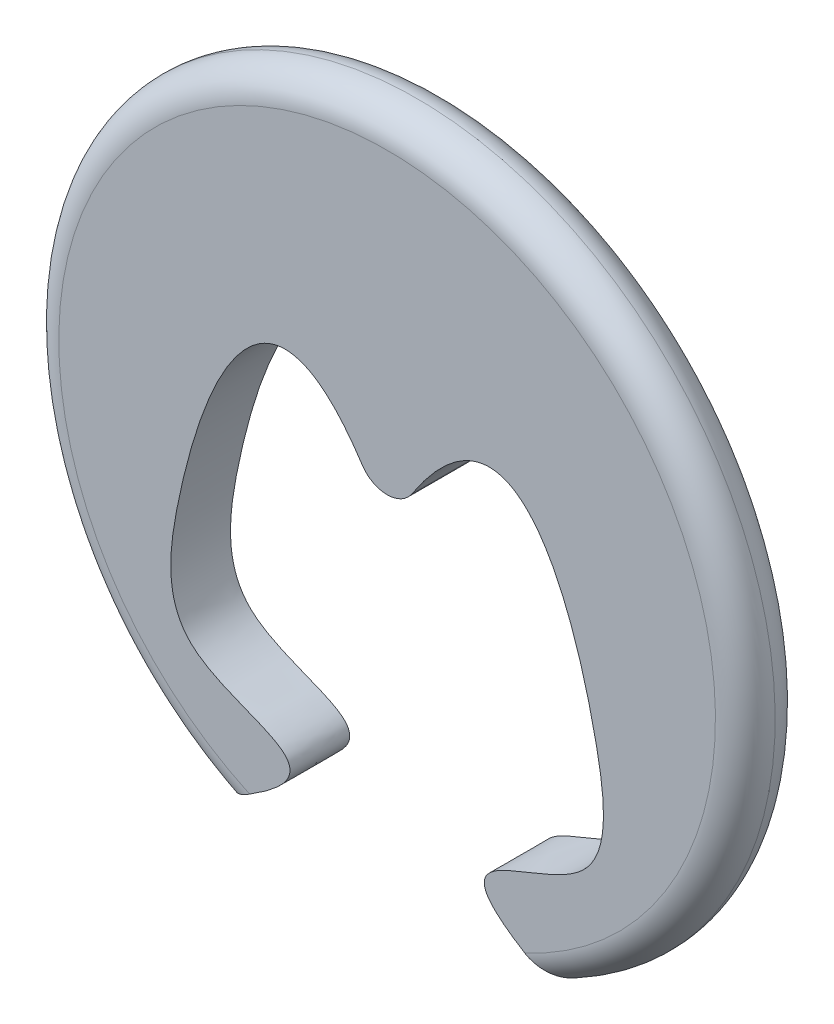
ISO-10303-21;
HEADER;
FILE_DESCRIPTION(('STEP AP214'),'2;1');
FILE_NAME('part.step','',(''),(''),'','','');
FILE_SCHEMA(('AUTOMOTIVE_DESIGN { 1 0 10303 214 1 1 1 1 }'));
ENDSEC;
DATA;
#1=APPLICATION_CONTEXT('core data for automotive mechanical design processes');
#2=APPLICATION_PROTOCOL_DEFINITION('international standard','automotive_design',2000,#1);
#3=PRODUCT_CONTEXT('',#1,'mechanical');
#4=PRODUCT('Part','Part','',(#3));
#5=PRODUCT_RELATED_PRODUCT_CATEGORY('part','',(#4));
#6=PRODUCT_DEFINITION_FORMATION('','',#4);
#7=PRODUCT_DEFINITION_CONTEXT('part definition',#1,'design');
#8=PRODUCT_DEFINITION('design','',#6,#7);
#9=PRODUCT_DEFINITION_SHAPE('','',#8);
#10=(LENGTH_UNIT() NAMED_UNIT(*) SI_UNIT(.MILLI.,.METRE.));
#11=(NAMED_UNIT(*) PLANE_ANGLE_UNIT() SI_UNIT($,.RADIAN.));
#12=(NAMED_UNIT(*) SI_UNIT($,.STERADIAN.) SOLID_ANGLE_UNIT());
#13=UNCERTAINTY_MEASURE_WITH_UNIT(LENGTH_MEASURE(1.E-05),#10,'distance_accuracy_value','');
#14=(GEOMETRIC_REPRESENTATION_CONTEXT(3) GLOBAL_UNCERTAINTY_ASSIGNED_CONTEXT((#13)) GLOBAL_UNIT_ASSIGNED_CONTEXT((#10,
#11,#12)) REPRESENTATION_CONTEXT('',''));
#15=CARTESIAN_POINT('',(0.,0.,0.));
#16=DIRECTION('',(0.,0.,1.));
#17=DIRECTION('',(1.,0.,0.));
#18=AXIS2_PLACEMENT_3D('',#15,#16,#17);
#19=CARTESIAN_POINT('',(0.,0.,2.));
#20=CARTESIAN_POINT('',(3.65979881913404,7.11743267439284,2.));
#21=CARTESIAN_POINT('',(6.80970335198559,0.322044678219588,2.));
#22=CARTESIAN_POINT('',(7.75319263490416,-8.22241206273269,2.));
#23=CARTESIAN_POINT('',(0.474469774454767,-7.83378692685235,2.));
#24=CARTESIAN_POINT('',(5.65576400233115,-10.5835879336799,2.));
#25=B_SPLINE_CURVE_WITH_KNOTS('',3,(#19,#20,#21,#22,#23,#24),.UNSPECIFIED.,.F.,.F.,(4,1,1,4),
(0.,0.533034717463997,0.705821925623652,1.),.UNSPECIFIED.);
#26=DIRECTION('',(0.,0.,-1.));
#27=VECTOR('',#26,1.);
#28=SURFACE_OF_LINEAR_EXTRUSION('',#25,#27);
#29=CARTESIAN_POINT('',(4.60838555712829,-9.98813208547281,0.));
#30=CARTESIAN_POINT('',(4.68038566646152,-10.0327641880118,3.34633447427477E-05));
#31=CARTESIAN_POINT('',(4.75296319805985,-10.0766757581788,0.00749941074537131));
#32=CARTESIAN_POINT('',(4.89717506487973,-10.1622954938369,0.0375044079269216));
#33=CARTESIAN_POINT('',(4.96879503509605,-10.2039802752322,0.0601784940049152));
#34=CARTESIAN_POINT('',(5.10277485963724,-10.2807743816698,0.118704172044532));
#35=CARTESIAN_POINT('',(5.1654323490971,-10.3161393536408,0.153530392727018));
#36=CARTESIAN_POINT('',(5.28384209238256,-10.3822256566867,0.236367309725095));
#37=CARTESIAN_POINT('',(5.33962491228069,-10.4129676874054,0.284316347706214));
#38=CARTESIAN_POINT('',(5.42542785594563,-10.459864449386,0.376191107848589));
#39=CARTESIAN_POINT('',(5.45810427806351,-10.4776024121363,0.416846726279005));
#40=CARTESIAN_POINT('',(5.51723555852019,-10.5095568146979,0.503772659154157));
#41=CARTESIAN_POINT('',(5.54368950409626,-10.5237727378846,0.550043795820887));
#42=CARTESIAN_POINT('',(5.58911825388668,-10.5481104009603,0.647572915076467));
#43=CARTESIAN_POINT('',(5.6080376388623,-10.558201817458,0.698864513085223));
#44=CARTESIAN_POINT('',(5.63684068747439,-10.5735411182488,0.804563072655957));
#45=CARTESIAN_POINT('',(5.64674741721147,-10.5788013672867,0.858961700578626));
#46=CARTESIAN_POINT('',(5.65312470872732,-10.5821870201984,0.928152944237852));
#47=CARTESIAN_POINT('',(5.65411442789269,-10.582712396518,0.942509636402722));
#48=CARTESIAN_POINT('',(5.6554329807305,-10.5834122814836,0.971241936143769));
#49=CARTESIAN_POINT('',(5.65576272877627,-10.5835872755754,0.985617489898407));
#50=CARTESIAN_POINT('',(5.65576400233115,-10.5835879336799,0.999999999999999));
#51=B_SPLINE_CURVE_WITH_KNOTS('',3,(#29,#30,#31,#32,#33,#34,#35,#36,#37,#38,#39,#40,#41,#42,#43,
#44,#45,#46,#47,#48,#49,#50),.UNSPECIFIED.,.F.,.F.,(4,2,2,2,2,2,2,2,2,2,4),(0.,
0.254005187200136,0.510296134027698,0.748774654192881,0.986151355704829,1.15078323830348,
1.31543925538695,1.48128494423768,1.64670498006619,1.68989366730969,1.73302247618212),.UNSPECIFIED.);
#52=CARTESIAN_POINT('',(4.6083855571288,-9.98813208547197,0.));
#53=VERTEX_POINT('',#52);
#54=CARTESIAN_POINT('',(5.65576400233115,-10.5835879336799,1.));
#55=VERTEX_POINT('',#54);
#56=EDGE_CURVE('E54',#53,#55,#51,.T.);
#57=ORIENTED_EDGE('',*,*,#56,.T.);
#58=CARTESIAN_POINT('',(5.65576400233115,-10.5835879336799,1.));
#59=CARTESIAN_POINT('',(5.65576609497394,-10.5835887898851,1.02472006776371));
#60=CARTESIAN_POINT('',(5.65478745151681,-10.5830696872869,1.04942680472653));
#61=CARTESIAN_POINT('',(5.65089850565556,-10.5810052420366,1.09863459016446));
#62=CARTESIAN_POINT('',(5.6479889990658,-10.5794603221798,1.12313571917068));
#63=CARTESIAN_POINT('',(5.6364538379996,-10.5733312331223,1.19580197788547));
#64=CARTESIAN_POINT('',(5.62502072791548,-10.5672523502705,1.24342968568522));
#65=CARTESIAN_POINT('',(5.59531780853729,-10.5514135616444,1.3357346282245));
#66=CARTESIAN_POINT('',(5.57705634508976,-10.5416581493356,1.38041538672066));
#67=CARTESIAN_POINT('',(5.53458313500127,-10.5188781598042,1.46598816902031));
#68=CARTESIAN_POINT('',(5.51036486111038,-10.5058499960871,1.50687596849825));
#69=CARTESIAN_POINT('',(5.45532791450898,-10.4760945952584,1.58655931523264));
#70=CARTESIAN_POINT('',(5.4241930847658,-10.4591880800161,1.6250679156894));
#71=CARTESIAN_POINT('',(5.35751311130451,-10.4227461852207,1.69659164745488));
#72=CARTESIAN_POINT('',(5.32196724684131,-10.4032103760075,1.72960587893749));
#73=CARTESIAN_POINT('',(5.24144860471798,-10.3586221792496,1.79486435737956));
#74=CARTESIAN_POINT('',(5.195882015877,-10.3331889920249,1.82611479944676));
#75=CARTESIAN_POINT('',(5.10153768310431,-10.2799823838981,1.88092010533109));
#76=CARTESIAN_POINT('',(5.05275504430328,-10.2522053768086,1.90446289724236));
#77=CARTESIAN_POINT('',(4.93900309141031,-10.186650297161,1.94947211800305));
#78=CARTESIAN_POINT('',(4.87338108909118,-10.1482771770948,1.96843699581651));
#79=CARTESIAN_POINT('',(4.74113780232785,-10.0695121163935,1.99367450680128));
#80=CARTESIAN_POINT('',(4.67451944958002,-10.0291255015138,1.99997897348879));
#81=CARTESIAN_POINT('',(4.60838555712936,-9.98813208547232,2.00000000000001));
#82=B_SPLINE_CURVE_WITH_KNOTS('',3,(#58,#59,#60,#61,#62,#63,#64,#65,#66,#67,#68,#69,#70,#71,#72,
#73,#74,#75,#76,#77,#78,#79,#80,#81),.UNSPECIFIED.,.F.,.F.,(4,2,2,2,2,2,2,2,2,2,2,4),(0.,
0.0741096075322064,0.148188689393998,0.295460371927135,0.442552639242437,0.589806808470867,
0.746191855829305,0.902602489595749,1.08438765923484,1.26645619803042,1.50038517478064,
1.73372521702099),.UNSPECIFIED.);
#83=CARTESIAN_POINT('',(4.60838555712936,-9.98813208547231,2.));
#84=VERTEX_POINT('',#83);
#85=EDGE_CURVE('E47',#55,#84,#82,.T.);
#86=ORIENTED_EDGE('',*,*,#85,.T.);
#87=CARTESIAN_POINT('',(0.836360040492583,1.45313421289427,2.));
#88=VERTEX_POINT('',#87);
#89=EDGE_CURVE('E98',#88,#84,#25,.T.);
#90=ORIENTED_EDGE('',*,*,#89,.F.);
#91=DIRECTION('',(0.,0.,-1.));
#92=VECTOR('',#91,1.);
#93=CARTESIAN_POINT('',(0.836360040492583,1.45313421289427,2.));
#94=LINE('',#93,#92);
#95=CARTESIAN_POINT('',(0.836360040492583,1.45313421289427,0.));
#96=VERTEX_POINT('',#95);
#97=EDGE_CURVE('E91',#88,#96,#94,.T.);
#98=ORIENTED_EDGE('',*,*,#97,.T.);
#99=CARTESIAN_POINT('',(0.,0.,0.));
#100=CARTESIAN_POINT('',(3.65979881913404,7.11743267439284,0.));
#101=CARTESIAN_POINT('',(6.80970335198559,0.322044678219588,0.));
#102=CARTESIAN_POINT('',(7.75319263490416,-8.22241206273269,0.));
#103=CARTESIAN_POINT('',(0.474469774454767,-7.83378692685235,0.));
#104=CARTESIAN_POINT('',(5.65576400233115,-10.5835879336799,0.));
#105=B_SPLINE_CURVE_WITH_KNOTS('',3,(#99,#100,#101,#102,#103,#104),.UNSPECIFIED.,.F.,.F.,(4,1,1,
4),(0.,0.533034717463997,0.705821925623652,1.),.UNSPECIFIED.);
#106=EDGE_CURVE('E96',#96,#53,#105,.T.);
#107=ORIENTED_EDGE('',*,*,#106,.T.);
#108=EDGE_LOOP('',(#57,#86,#90,#98,#107));
#109=FACE_BOUND('',#108,.T.);
#110=ADVANCED_FACE('F37',(#109),#28,.F.);
#111=CARTESIAN_POINT('',(-5.65576400233115,-10.5835879336799,2.));
#112=CARTESIAN_POINT('',(-0.474469774454767,-7.83378692685235,2.));
#113=CARTESIAN_POINT('',(-7.75319263490416,-8.22241206273269,2.));
#114=CARTESIAN_POINT('',(-6.80970335198559,0.322044678219588,2.));
#115=CARTESIAN_POINT('',(-3.65979881913404,7.11743267439284,2.));
#116=CARTESIAN_POINT('',(0.,0.,2.));
#117=B_SPLINE_CURVE_WITH_KNOTS('',3,(#111,#112,#113,#114,#115,#116),.UNSPECIFIED.,.F.,.F.,(4,1,
1,4),(0.,0.294178074376348,0.466965282536003,1.),.UNSPECIFIED.);
#118=DIRECTION('',(0.,0.,-1.));
#119=VECTOR('',#118,1.);
#120=SURFACE_OF_LINEAR_EXTRUSION('',#117,#119);
#121=CARTESIAN_POINT('',(-4.60838555712936,-9.98813208547231,2.));
#122=VERTEX_POINT('',#121);
#123=CARTESIAN_POINT('',(-0.836360040492583,1.45313421289427,2.));
#124=VERTEX_POINT('',#123);
#125=EDGE_CURVE('E99',#122,#124,#117,.T.);
#126=ORIENTED_EDGE('',*,*,#125,.F.);
#127=CARTESIAN_POINT('',(-4.60838555712936,-9.98813208547231,2.));
#128=CARTESIAN_POINT('',(-4.68038566646227,-10.0327641880119,1.99996653665522));
#129=CARTESIAN_POINT('',(-4.75296319806048,-10.076675758179,1.99250058925455));
#130=CARTESIAN_POINT('',(-4.89717506488026,-10.1622954938373,1.96249559207292));
#131=CARTESIAN_POINT('',(-4.96879503509661,-10.2039802752325,1.93982150599488));
#132=CARTESIAN_POINT('',(-5.10277485963772,-10.28077438167,1.88129582795522));
#133=CARTESIAN_POINT('',(-5.16543234909748,-10.316139353641,1.84646960727275));
#134=CARTESIAN_POINT('',(-5.28384209238276,-10.3822256566868,1.76363269027474));
#135=CARTESIAN_POINT('',(-5.33962491228081,-10.4129676874054,1.71568365229368));
#136=CARTESIAN_POINT('',(-5.42542785594567,-10.4598644493861,1.62380889215136));
#137=CARTESIAN_POINT('',(-5.45810427806355,-10.4776024121363,1.58315327372094));
#138=CARTESIAN_POINT('',(-5.51723555852023,-10.509556814698,1.49622734084578));
#139=CARTESIAN_POINT('',(-5.54368950409629,-10.5237727378847,1.44995620417905));
#140=CARTESIAN_POINT('',(-5.58911825388671,-10.5481104009603,1.35242708492347));
#141=CARTESIAN_POINT('',(-5.60803763886232,-10.558201817458,1.30113548691471));
#142=CARTESIAN_POINT('',(-5.63684068747441,-10.5735411182488,1.19543692734398));
#143=CARTESIAN_POINT('',(-5.64674741721148,-10.5788013672867,1.14103829942131));
#144=CARTESIAN_POINT('',(-5.65312470872733,-10.5821870201984,1.0718470557621));
#145=CARTESIAN_POINT('',(-5.65411442789269,-10.582712396518,1.05749036359724));
#146=CARTESIAN_POINT('',(-5.6554329807305,-10.5834122814836,1.02875806385621));
#147=CARTESIAN_POINT('',(-5.65576272877626,-10.5835872755754,1.01438251010158));
#148=CARTESIAN_POINT('',(-5.65576400233115,-10.5835879336799,1.));
#149=B_SPLINE_CURVE_WITH_KNOTS('',3,(#127,#128,#129,#130,#131,#132,#133,#134,#135,#136,#137,
#138,#139,#140,#141,#142,#143,#144,#145,#146,#147,#148),.UNSPECIFIED.,.F.,.F.,(4,2,2,2,2,2,2,2,
2,2,4),(0.,0.254005187200157,0.510296134027732,0.748774654192606,0.986151355704249,
1.15078323830289,1.31543925538636,1.48128494423709,1.6467049800656,1.68989366730907,
1.73302247618147),.UNSPECIFIED.);
#150=CARTESIAN_POINT('',(-5.65576400233115,-10.5835879336799,1.));
#151=VERTEX_POINT('',#150);
#152=EDGE_CURVE('E135',#122,#151,#149,.T.);
#153=ORIENTED_EDGE('',*,*,#152,.T.);
#154=CARTESIAN_POINT('',(-5.65576400233115,-10.5835879336799,1.));
#155=CARTESIAN_POINT('',(-5.65576609497394,-10.5835887898851,0.975279932236294));
#156=CARTESIAN_POINT('',(-5.65478745151681,-10.5830696872869,0.950573195273469));
#157=CARTESIAN_POINT('',(-5.65089850565557,-10.5810052420366,0.901365409835536));
#158=CARTESIAN_POINT('',(-5.6479889990658,-10.5794603221798,0.876864280829317));
#159=CARTESIAN_POINT('',(-5.6364538379996,-10.5733312331223,0.804198022114531));
#160=CARTESIAN_POINT('',(-5.62502072791548,-10.5672523502705,0.756570314314776));
#161=CARTESIAN_POINT('',(-5.59531780853729,-10.5514135616444,0.664265371775501));
#162=CARTESIAN_POINT('',(-5.57705634508976,-10.5416581493356,0.619584613279343));
#163=CARTESIAN_POINT('',(-5.53458313500127,-10.5188781598042,0.534011830979686));
#164=CARTESIAN_POINT('',(-5.51036486111038,-10.5058499960871,0.493124031501744));
#165=CARTESIAN_POINT('',(-5.45532791450898,-10.4760945952584,0.413440684767357));
#166=CARTESIAN_POINT('',(-5.42419308476579,-10.4591880800161,0.3749320843106));
#167=CARTESIAN_POINT('',(-5.3575131113045,-10.4227461852207,0.30340835254512));
#168=CARTESIAN_POINT('',(-5.32196724684131,-10.4032103760075,0.270394121062509));
#169=CARTESIAN_POINT('',(-5.24144860471798,-10.3586221792496,0.205135642620437));
#170=CARTESIAN_POINT('',(-5.195882015877,-10.3331889920249,0.173885200553233));
#171=CARTESIAN_POINT('',(-5.10153768310431,-10.2799823838981,0.11907989466891));
#172=CARTESIAN_POINT('',(-5.05275504430327,-10.2522053768086,0.0955371027576331));
#173=CARTESIAN_POINT('',(-4.9390030914103,-10.186650297161,0.0505278819969398));
#174=CARTESIAN_POINT('',(-4.87338108909117,-10.1482771770948,0.0315630041834889));
#175=CARTESIAN_POINT('',(-4.74113780232785,-10.0695121163935,0.00632549319871633));
#176=CARTESIAN_POINT('',(-4.67451944958001,-10.0291255015138,2.1026511212157E-05));
#177=CARTESIAN_POINT('',(-4.60838555712936,-9.98813208547231,0.));
#178=B_SPLINE_CURVE_WITH_KNOTS('',3,(#154,#155,#156,#157,#158,#159,#160,#161,#162,#163,#164,
#165,#166,#167,#168,#169,#170,#171,#172,#173,#174,#175,#176,#177),.UNSPECIFIED.,.F.,.F.,(4,2,2,
2,2,2,2,2,2,2,2,4),(0.,0.0741096075322062,0.148188689393998,0.295460371927137,0.442552639242441,
0.589806808470873,0.74619185582931,0.902602489595752,1.08438765923485,1.26645619803042,
1.50038517478065,1.733725217021),.UNSPECIFIED.);
#179=CARTESIAN_POINT('',(-4.60838555712936,-9.98813208547231,0.));
#180=VERTEX_POINT('',#179);
#181=EDGE_CURVE('E128',#151,#180,#178,.T.);
#182=ORIENTED_EDGE('',*,*,#181,.T.);
#183=CARTESIAN_POINT('',(-5.65576400233115,-10.5835879336799,0.));
#184=CARTESIAN_POINT('',(-0.474469774454767,-7.83378692685235,0.));
#185=CARTESIAN_POINT('',(-7.75319263490416,-8.22241206273269,0.));
#186=CARTESIAN_POINT('',(-6.80970335198559,0.322044678219588,0.));
#187=CARTESIAN_POINT('',(-3.65979881913404,7.11743267439284,0.));
#188=CARTESIAN_POINT('',(0.,0.,0.));
#189=B_SPLINE_CURVE_WITH_KNOTS('',3,(#183,#184,#185,#186,#187,#188),.UNSPECIFIED.,.F.,.F.,(4,1,
1,4),(0.,0.294178074376348,0.466965282536003,1.),.UNSPECIFIED.);
#190=CARTESIAN_POINT('',(-0.836360040492583,1.45313421289427,0.));
#191=VERTEX_POINT('',#190);
#192=EDGE_CURVE('E102',#180,#191,#189,.T.);
#193=ORIENTED_EDGE('',*,*,#192,.T.);
#194=DIRECTION('',(0.,0.,-1.));
#195=VECTOR('',#194,1.);
#196=CARTESIAN_POINT('',(-0.836360040492583,1.45313421289427,0.));
#197=LINE('',#196,#195);
#198=EDGE_CURVE('E93',#191,#124,#197,.F.);
#199=ORIENTED_EDGE('',*,*,#198,.T.);
#200=EDGE_LOOP('',(#126,#153,#182,#193,#199));
#201=FACE_BOUND('',#200,.T.);
#202=ADVANCED_FACE('F141',(#201),#120,.F.);
#203=CARTESIAN_POINT('',(6.80555692273949,-1.83518350731557,2.));
#204=DIRECTION('',(0.,0.,1.));
#205=DIRECTION('',(1.,0.,0.));
#206=AXIS2_PLACEMENT_3D('',#203,#204,#205);
#207=PLANE('',#206);
#208=ORIENTED_EDGE('',*,*,#89,.T.);
#209=CARTESIAN_POINT('',(0.,0.,2.));
#210=DIRECTION('',(0.,0.,1.));
#211=DIRECTION('',(1.,0.,0.));
#212=AXIS2_PLACEMENT_3D('',#209,#210,#211);
#213=CIRCLE('',#212,11.);
#214=EDGE_CURVE('E125',#84,#122,#213,.T.);
#215=ORIENTED_EDGE('',*,*,#214,.T.);
#216=ORIENTED_EDGE('',*,*,#125,.T.);
#217=CARTESIAN_POINT('',(0.,2.00131473304,2.));
#218=DIRECTION('',(0.,0.,1.));
#219=DIRECTION('',(1.,0.,0.));
#220=AXIS2_PLACEMENT_3D('',#217,#218,#219);
#221=CIRCLE('',#220,1.);
#222=EDGE_CURVE('E123',#124,#88,#221,.T.);
#223=ORIENTED_EDGE('',*,*,#222,.T.);
#224=EDGE_LOOP('',(#208,#215,#216,#223));
#225=FACE_BOUND('',#224,.T.);
#226=ADVANCED_FACE('F146',(#225),#207,.T.);
#227=CARTESIAN_POINT('',(6.80555692273949,-1.83518350731557,0.));
#228=DIRECTION('',(0.,0.,1.));
#229=DIRECTION('',(1.,0.,0.));
#230=AXIS2_PLACEMENT_3D('',#227,#228,#229);
#231=PLANE('',#230);
#232=ORIENTED_EDGE('',*,*,#192,.F.);
#233=CARTESIAN_POINT('',(0.,0.,0.));
#234=DIRECTION('',(0.,0.,1.));
#235=DIRECTION('',(1.,0.,0.));
#236=AXIS2_PLACEMENT_3D('',#233,#234,#235);
#237=CIRCLE('',#236,11.);
#238=EDGE_CURVE('E11',#180,#53,#237,.F.);
#239=ORIENTED_EDGE('',*,*,#238,.T.);
#240=ORIENTED_EDGE('',*,*,#106,.F.);
#241=CARTESIAN_POINT('',(0.,2.00131473304,0.));
#242=DIRECTION('',(0.,0.,1.));
#243=DIRECTION('',(1.,0.,0.));
#244=AXIS2_PLACEMENT_3D('',#241,#242,#243);
#245=CIRCLE('',#244,1.);
#246=EDGE_CURVE('E87',#96,#191,#245,.F.);
#247=ORIENTED_EDGE('',*,*,#246,.T.);
#248=EDGE_LOOP('',(#232,#239,#240,#247));
#249=FACE_BOUND('',#248,.T.);
#250=ADVANCED_FACE('F101',(#249),#231,.F.);
#251=CARTESIAN_POINT('',(0.,2.00131473304,1.));
#252=DIRECTION('',(0.,0.,-1.));
#253=DIRECTION('',(-1.,0.,0.));
#254=AXIS2_PLACEMENT_3D('',#251,#252,#253);
#255=CYLINDRICAL_SURFACE('',#254,1.);
#256=ORIENTED_EDGE('',*,*,#222,.F.);
#257=ORIENTED_EDGE('',*,*,#198,.F.);
#258=ORIENTED_EDGE('',*,*,#246,.F.);
#259=ORIENTED_EDGE('',*,*,#97,.F.);
#260=EDGE_LOOP('',(#256,#257,#258,#259));
#261=FACE_BOUND('',#260,.T.);
#262=ADVANCED_FACE('F90',(#261),#255,.T.);
#263=CARTESIAN_POINT('',(0.,0.,1.));
#264=DIRECTION('',(0.,0.,1.));
#265=DIRECTION('',(1.,0.,0.));
#266=AXIS2_PLACEMENT_3D('',#263,#264,#265);
#267=TOROIDAL_SURFACE('',#266,11.,1.);
#268=CARTESIAN_POINT('',(0.,0.,1.));
#269=DIRECTION('',(0.,0.,1.));
#270=DIRECTION('',(1.,0.,0.));
#271=AXIS2_PLACEMENT_3D('',#268,#269,#270);
#272=CIRCLE('',#271,12.);
#273=EDGE_CURVE('E42',#55,#151,#272,.T.);
#274=ORIENTED_EDGE('',*,*,#273,.F.);
#275=ORIENTED_EDGE('',*,*,#56,.F.);
#276=ORIENTED_EDGE('',*,*,#238,.F.);
#277=ORIENTED_EDGE('',*,*,#181,.F.);
#278=EDGE_LOOP('',(#274,#275,#276,#277));
#279=FACE_BOUND('',#278,.T.);
#280=ADVANCED_FACE('F39',(#279),#267,.T.);
#281=CARTESIAN_POINT('',(0.,0.,1.));
#282=DIRECTION('',(0.,0.,1.));
#283=DIRECTION('',(1.,0.,0.));
#284=AXIS2_PLACEMENT_3D('',#281,#282,#283);
#285=TOROIDAL_SURFACE('',#284,11.,1.);
#286=ORIENTED_EDGE('',*,*,#85,.F.);
#287=ORIENTED_EDGE('',*,*,#273,.T.);
#288=ORIENTED_EDGE('',*,*,#152,.F.);
#289=ORIENTED_EDGE('',*,*,#214,.F.);
#290=EDGE_LOOP('',(#286,#287,#288,#289));
#291=FACE_BOUND('',#290,.T.);
#292=ADVANCED_FACE('F175',(#291),#285,.T.);
#293=CLOSED_SHELL('',(#110,#202,#226,#250,#262,#280,#292));
#294=MANIFOLD_SOLID_BREP('B2',#293);
#295=ADVANCED_BREP_SHAPE_REPRESENTATION('',(#18,#294),#14);
#296=SHAPE_DEFINITION_REPRESENTATION(#9,#295);
ENDSEC;
END-ISO-10303-21;
